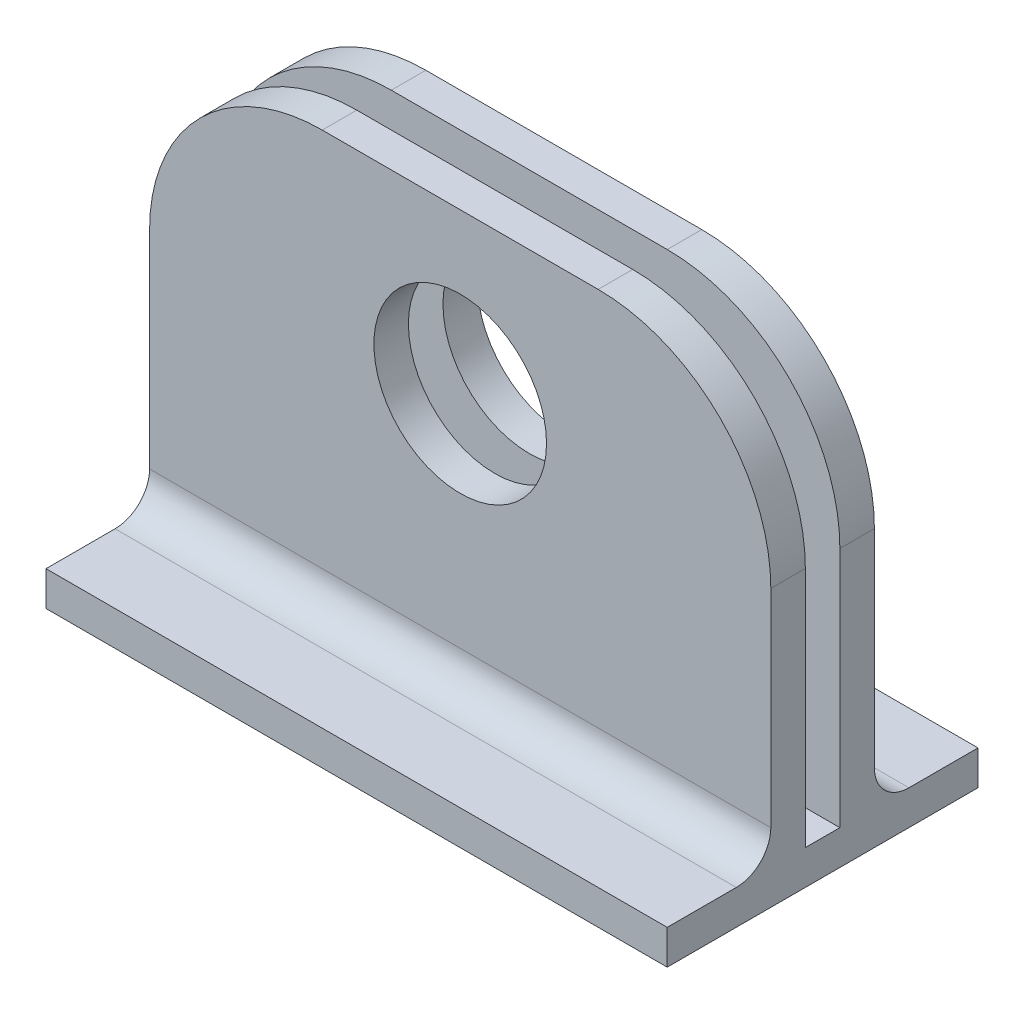
ISO-10303-21;
HEADER;
FILE_DESCRIPTION(('STEP AP214'),'2;1');
FILE_NAME('part.step','',(''),(''),'','','');
FILE_SCHEMA(('AUTOMOTIVE_DESIGN { 1 0 10303 214 1 1 1 1 }'));
ENDSEC;
DATA;
#1=APPLICATION_CONTEXT('core data for automotive mechanical design processes');
#2=APPLICATION_PROTOCOL_DEFINITION('international standard','automotive_design',2000,#1);
#3=PRODUCT_CONTEXT('',#1,'mechanical');
#4=PRODUCT('Part','Part','',(#3));
#5=PRODUCT_RELATED_PRODUCT_CATEGORY('part','',(#4));
#6=PRODUCT_DEFINITION_FORMATION('','',#4);
#7=PRODUCT_DEFINITION_CONTEXT('part definition',#1,'design');
#8=PRODUCT_DEFINITION('design','',#6,#7);
#9=PRODUCT_DEFINITION_SHAPE('','',#8);
#10=(LENGTH_UNIT() NAMED_UNIT(*) SI_UNIT(.MILLI.,.METRE.));
#11=(NAMED_UNIT(*) PLANE_ANGLE_UNIT() SI_UNIT($,.RADIAN.));
#12=(NAMED_UNIT(*) SI_UNIT($,.STERADIAN.) SOLID_ANGLE_UNIT());
#13=UNCERTAINTY_MEASURE_WITH_UNIT(LENGTH_MEASURE(1.E-05),#10,'distance_accuracy_value','');
#14=(GEOMETRIC_REPRESENTATION_CONTEXT(3) GLOBAL_UNCERTAINTY_ASSIGNED_CONTEXT((#13)) GLOBAL_UNIT_ASSIGNED_CONTEXT((#10,
#11,#12)) REPRESENTATION_CONTEXT('',''));
#15=CARTESIAN_POINT('',(0.,0.,0.));
#16=DIRECTION('',(0.,0.,1.));
#17=DIRECTION('',(1.,0.,0.));
#18=AXIS2_PLACEMENT_3D('',#15,#16,#17);
#19=CARTESIAN_POINT('',(35.9807500278961,2.,12.));
#20=DIRECTION('',(0.,1.,0.));
#21=DIRECTION('',(-1.,0.,0.));
#22=AXIS2_PLACEMENT_3D('',#19,#20,#21);
#23=PLANE('',#22);
#24=DIRECTION('',(0.,0.,-1.));
#25=VECTOR('',#24,1.);
#26=CARTESIAN_POINT('',(35.9807500278961,2.,12.));
#27=LINE('',#26,#25);
#28=CARTESIAN_POINT('',(35.9807500278961,2.,12.));
#29=VERTEX_POINT('',#28);
#30=CARTESIAN_POINT('',(35.9807500278961,2.,8.));
#31=VERTEX_POINT('',#30);
#32=EDGE_CURVE('E290',#29,#31,#27,.T.);
#33=ORIENTED_EDGE('',*,*,#32,.T.);
#34=DIRECTION('',(-1.,0.,0.));
#35=VECTOR('',#34,1.);
#36=CARTESIAN_POINT('',(35.9807500278961,2.,8.));
#37=LINE('',#36,#35);
#38=CARTESIAN_POINT('',(0.,2.,8.));
#39=VERTEX_POINT('',#38);
#40=EDGE_CURVE('E199',#31,#39,#37,.T.);
#41=ORIENTED_EDGE('',*,*,#40,.T.);
#42=DIRECTION('',(0.,0.,-1.));
#43=VECTOR('',#42,1.);
#44=CARTESIAN_POINT('',(0.,2.,12.));
#45=LINE('',#44,#43);
#46=CARTESIAN_POINT('',(0.,2.,12.));
#47=VERTEX_POINT('',#46);
#48=EDGE_CURVE('E180',#47,#39,#45,.T.);
#49=ORIENTED_EDGE('',*,*,#48,.F.);
#50=DIRECTION('',(1.,0.,0.));
#51=VECTOR('',#50,1.);
#52=CARTESIAN_POINT('',(35.9807500278961,2.,12.));
#53=LINE('',#52,#51);
#54=EDGE_CURVE('E287',#47,#29,#53,.T.);
#55=ORIENTED_EDGE('',*,*,#54,.T.);
#56=EDGE_LOOP('',(#33,#41,#49,#55));
#57=FACE_BOUND('',#56,.T.);
#58=ADVANCED_FACE('F35',(#57),#23,.T.);
#59=CARTESIAN_POINT('',(0.,0.,2.));
#60=DIRECTION('',(1.,0.,0.));
#61=DIRECTION('',(0.,0.,-1.));
#62=AXIS2_PLACEMENT_3D('',#59,#60,#61);
#63=PLANE('',#62);
#64=DIRECTION('',(0.,-1.,0.));
#65=VECTOR('',#64,1.);
#66=CARTESIAN_POINT('',(0.,0.,2.));
#67=LINE('',#66,#65);
#68=CARTESIAN_POINT('',(0.,16.,2.));
#69=VERTEX_POINT('',#68);
#70=CARTESIAN_POINT('',(0.,2.,2.));
#71=VERTEX_POINT('',#70);
#72=EDGE_CURVE('E297',#69,#71,#67,.T.);
#73=ORIENTED_EDGE('',*,*,#72,.F.);
#74=DIRECTION('',(0.,0.,-1.));
#75=VECTOR('',#74,1.);
#76=CARTESIAN_POINT('',(0.,16.,2.));
#77=LINE('',#76,#75);
#78=CARTESIAN_POINT('',(0.,16.,0.));
#79=VERTEX_POINT('',#78);
#80=EDGE_CURVE('E11',#69,#79,#77,.T.);
#81=ORIENTED_EDGE('',*,*,#80,.T.);
#82=DIRECTION('',(0.,-1.,0.));
#83=VECTOR('',#82,1.);
#84=CARTESIAN_POINT('',(0.,0.,0.));
#85=LINE('',#84,#83);
#86=CARTESIAN_POINT('',(0.,4.,0.));
#87=VERTEX_POINT('',#86);
#88=EDGE_CURVE('E296',#79,#87,#85,.T.);
#89=ORIENTED_EDGE('',*,*,#88,.T.);
#90=CARTESIAN_POINT('',(0.,4.,-2.));
#91=DIRECTION('',(1.,0.,0.));
#92=DIRECTION('',(0.,0.,-1.));
#93=AXIS2_PLACEMENT_3D('',#90,#91,#92);
#94=CIRCLE('',#93,2.);
#95=CARTESIAN_POINT('',(0.,2.,-2.));
#96=VERTEX_POINT('',#95);
#97=EDGE_CURVE('E206',#87,#96,#94,.T.);
#98=ORIENTED_EDGE('',*,*,#97,.T.);
#99=CARTESIAN_POINT('',(0.,2.,-6.));
#100=VERTEX_POINT('',#99);
#101=EDGE_CURVE('E181',#96,#100,#45,.T.);
#102=ORIENTED_EDGE('',*,*,#101,.T.);
#103=DIRECTION('',(0.,1.,0.));
#104=VECTOR('',#103,1.);
#105=CARTESIAN_POINT('',(0.,0.,-6.));
#106=LINE('',#105,#104);
#107=CARTESIAN_POINT('',(0.,0.,-6.));
#108=VERTEX_POINT('',#107);
#109=EDGE_CURVE('E272',#108,#100,#106,.T.);
#110=ORIENTED_EDGE('',*,*,#109,.F.);
#111=DIRECTION('',(0.,0.,-1.));
#112=VECTOR('',#111,1.);
#113=CARTESIAN_POINT('',(0.,0.,2.));
#114=LINE('',#113,#112);
#115=CARTESIAN_POINT('',(0.,0.,12.));
#116=VERTEX_POINT('',#115);
#117=EDGE_CURVE('E188',#116,#108,#114,.T.);
#118=ORIENTED_EDGE('',*,*,#117,.F.);
#119=DIRECTION('',(0.,1.,0.));
#120=VECTOR('',#119,1.);
#121=CARTESIAN_POINT('',(0.,0.,12.));
#122=LINE('',#121,#120);
#123=EDGE_CURVE('E284',#116,#47,#122,.T.);
#124=ORIENTED_EDGE('',*,*,#123,.T.);
#125=ORIENTED_EDGE('',*,*,#48,.T.);
#126=CARTESIAN_POINT('',(0.,4.,8.));
#127=DIRECTION('',(1.,0.,0.));
#128=DIRECTION('',(0.,0.,-1.));
#129=AXIS2_PLACEMENT_3D('',#126,#127,#128);
#130=CIRCLE('',#129,2.);
#131=CARTESIAN_POINT('',(0.,4.,6.));
#132=VERTEX_POINT('',#131);
#133=EDGE_CURVE('E208',#39,#132,#130,.T.);
#134=ORIENTED_EDGE('',*,*,#133,.T.);
#135=DIRECTION('',(0.,-1.,0.));
#136=VECTOR('',#135,1.);
#137=CARTESIAN_POINT('',(0.,0.,6.));
#138=LINE('',#137,#136);
#139=CARTESIAN_POINT('',(0.,16.,6.));
#140=VERTEX_POINT('',#139);
#141=EDGE_CURVE('E264',#140,#132,#138,.T.);
#142=ORIENTED_EDGE('',*,*,#141,.F.);
#143=DIRECTION('',(0.,0.,-1.));
#144=VECTOR('',#143,1.);
#145=CARTESIAN_POINT('',(0.,16.,2.));
#146=LINE('',#145,#144);
#147=CARTESIAN_POINT('',(0.,16.,4.));
#148=VERTEX_POINT('',#147);
#149=EDGE_CURVE('E44',#140,#148,#146,.T.);
#150=ORIENTED_EDGE('',*,*,#149,.T.);
#151=DIRECTION('',(0.,-1.,0.));
#152=VECTOR('',#151,1.);
#153=CARTESIAN_POINT('',(0.,0.,4.));
#154=LINE('',#153,#152);
#155=CARTESIAN_POINT('',(0.,2.,4.));
#156=VERTEX_POINT('',#155);
#157=EDGE_CURVE('E163',#148,#156,#154,.T.);
#158=ORIENTED_EDGE('',*,*,#157,.T.);
#159=EDGE_CURVE('E167',#156,#71,#45,.T.);
#160=ORIENTED_EDGE('',*,*,#159,.T.);
#161=EDGE_LOOP('',(#73,#81,#89,#98,#102,#110,#118,#124,#125,#134,#142,#150,#158,#160));
#162=FACE_BOUND('',#161,.T.);
#163=ADVANCED_FACE('F166',(#162),#63,.F.);
#164=CARTESIAN_POINT('',(0.,0.,2.));
#165=DIRECTION('',(0.,1.,0.));
#166=DIRECTION('',(0.,0.,1.));
#167=AXIS2_PLACEMENT_3D('',#164,#165,#166);
#168=PLANE('',#167);
#169=DIRECTION('',(-1.,0.,0.));
#170=VECTOR('',#169,1.);
#171=CARTESIAN_POINT('',(35.9807500278961,0.,-6.));
#172=LINE('',#171,#170);
#173=CARTESIAN_POINT('',(35.9807500278961,0.,-6.));
#174=VERTEX_POINT('',#173);
#175=EDGE_CURVE('E269',#174,#108,#172,.T.);
#176=ORIENTED_EDGE('',*,*,#175,.F.);
#177=DIRECTION('',(0.,0.,-1.));
#178=VECTOR('',#177,1.);
#179=CARTESIAN_POINT('',(35.9807500278961,0.,2.));
#180=LINE('',#179,#178);
#181=CARTESIAN_POINT('',(35.9807500278961,0.,12.));
#182=VERTEX_POINT('',#181);
#183=EDGE_CURVE('E193',#182,#174,#180,.T.);
#184=ORIENTED_EDGE('',*,*,#183,.F.);
#185=DIRECTION('',(-1.,0.,0.));
#186=VECTOR('',#185,1.);
#187=CARTESIAN_POINT('',(35.9807500278961,0.,12.));
#188=LINE('',#187,#186);
#189=EDGE_CURVE('E281',#182,#116,#188,.T.);
#190=ORIENTED_EDGE('',*,*,#189,.T.);
#191=ORIENTED_EDGE('',*,*,#117,.T.);
#192=EDGE_LOOP('',(#176,#184,#190,#191));
#193=FACE_BOUND('',#192,.T.);
#194=ADVANCED_FACE('F316',(#193),#168,.F.);
#195=CARTESIAN_POINT('',(35.9807500278961,0.,2.));
#196=DIRECTION('',(-1.,0.,0.));
#197=DIRECTION('',(0.,0.,1.));
#198=AXIS2_PLACEMENT_3D('',#195,#196,#197);
#199=PLANE('',#198);
#200=DIRECTION('',(0.,1.,0.));
#201=VECTOR('',#200,1.);
#202=CARTESIAN_POINT('',(35.9807500278961,0.,0.));
#203=LINE('',#202,#201);
#204=CARTESIAN_POINT('',(35.9807500278961,4.,0.));
#205=VERTEX_POINT('',#204);
#206=CARTESIAN_POINT('',(35.9807500278961,16.,0.));
#207=VERTEX_POINT('',#206);
#208=EDGE_CURVE('E307',#205,#207,#203,.T.);
#209=ORIENTED_EDGE('',*,*,#208,.T.);
#210=DIRECTION('',(0.,0.,-1.));
#211=VECTOR('',#210,1.);
#212=CARTESIAN_POINT('',(35.9807500278961,16.,2.));
#213=LINE('',#212,#211);
#214=CARTESIAN_POINT('',(35.9807500278961,16.,2.));
#215=VERTEX_POINT('',#214);
#216=EDGE_CURVE('E224',#207,#215,#213,.F.);
#217=ORIENTED_EDGE('',*,*,#216,.T.);
#218=DIRECTION('',(0.,1.,0.));
#219=VECTOR('',#218,1.);
#220=CARTESIAN_POINT('',(35.9807500278961,0.,2.));
#221=LINE('',#220,#219);
#222=CARTESIAN_POINT('',(35.9807500278961,2.,2.));
#223=VERTEX_POINT('',#222);
#224=EDGE_CURVE('E299',#223,#215,#221,.T.);
#225=ORIENTED_EDGE('',*,*,#224,.F.);
#226=CARTESIAN_POINT('',(35.9807500278961,2.,4.));
#227=VERTEX_POINT('',#226);
#228=EDGE_CURVE('E262',#227,#223,#27,.T.);
#229=ORIENTED_EDGE('',*,*,#228,.F.);
#230=DIRECTION('',(0.,1.,0.));
#231=VECTOR('',#230,1.);
#232=CARTESIAN_POINT('',(35.9807500278961,0.,4.));
#233=LINE('',#232,#231);
#234=CARTESIAN_POINT('',(35.9807500278961,16.,4.));
#235=VERTEX_POINT('',#234);
#236=EDGE_CURVE('E171',#227,#235,#233,.T.);
#237=ORIENTED_EDGE('',*,*,#236,.T.);
#238=DIRECTION('',(0.,0.,-1.));
#239=VECTOR('',#238,1.);
#240=CARTESIAN_POINT('',(35.9807500278961,16.,2.));
#241=LINE('',#240,#239);
#242=CARTESIAN_POINT('',(35.9807500278961,16.,6.));
#243=VERTEX_POINT('',#242);
#244=EDGE_CURVE('E222',#235,#243,#241,.F.);
#245=ORIENTED_EDGE('',*,*,#244,.T.);
#246=DIRECTION('',(0.,1.,0.));
#247=VECTOR('',#246,1.);
#248=CARTESIAN_POINT('',(35.9807500278961,0.,6.));
#249=LINE('',#248,#247);
#250=CARTESIAN_POINT('',(35.9807500278961,4.,6.));
#251=VERTEX_POINT('',#250);
#252=EDGE_CURVE('E247',#251,#243,#249,.T.);
#253=ORIENTED_EDGE('',*,*,#252,.F.);
#254=CARTESIAN_POINT('',(35.9807500278961,4.,8.));
#255=DIRECTION('',(-1.,0.,0.));
#256=DIRECTION('',(0.,0.,1.));
#257=AXIS2_PLACEMENT_3D('',#254,#255,#256);
#258=CIRCLE('',#257,2.);
#259=EDGE_CURVE('E211',#251,#31,#258,.T.);
#260=ORIENTED_EDGE('',*,*,#259,.T.);
#261=ORIENTED_EDGE('',*,*,#32,.F.);
#262=DIRECTION('',(0.,-1.,0.));
#263=VECTOR('',#262,1.);
#264=CARTESIAN_POINT('',(35.9807500278961,0.,12.));
#265=LINE('',#264,#263);
#266=EDGE_CURVE('E278',#29,#182,#265,.T.);
#267=ORIENTED_EDGE('',*,*,#266,.T.);
#268=ORIENTED_EDGE('',*,*,#183,.T.);
#269=DIRECTION('',(0.,-1.,0.));
#270=VECTOR('',#269,1.);
#271=CARTESIAN_POINT('',(35.9807500278961,0.,-6.));
#272=LINE('',#271,#270);
#273=CARTESIAN_POINT('',(35.9807500278961,2.,-6.));
#274=VERTEX_POINT('',#273);
#275=EDGE_CURVE('E254',#274,#174,#272,.T.);
#276=ORIENTED_EDGE('',*,*,#275,.F.);
#277=CARTESIAN_POINT('',(35.9807500278961,2.,-2.));
#278=VERTEX_POINT('',#277);
#279=EDGE_CURVE('E292',#278,#274,#27,.T.);
#280=ORIENTED_EDGE('',*,*,#279,.F.);
#281=CARTESIAN_POINT('',(35.9807500278961,4.,-2.));
#282=DIRECTION('',(-1.,0.,0.));
#283=DIRECTION('',(0.,0.,1.));
#284=AXIS2_PLACEMENT_3D('',#281,#282,#283);
#285=CIRCLE('',#284,2.);
#286=EDGE_CURVE('E204',#278,#205,#285,.T.);
#287=ORIENTED_EDGE('',*,*,#286,.T.);
#288=EDGE_LOOP('',(#209,#217,#225,#229,#237,#245,#253,#260,#261,#267,#268,#276,#280,#287));
#289=FACE_BOUND('',#288,.T.);
#290=ADVANCED_FACE('F260',(#289),#199,.F.);
#291=CARTESIAN_POINT('',(0.,26.,2.));
#292=DIRECTION('',(0.,-1.,0.));
#293=DIRECTION('',(0.,0.,-1.));
#294=AXIS2_PLACEMENT_3D('',#291,#292,#293);
#295=PLANE('',#294);
#296=DIRECTION('',(-1.,0.,0.));
#297=VECTOR('',#296,1.);
#298=CARTESIAN_POINT('',(0.,26.,2.));
#299=LINE('',#298,#297);
#300=CARTESIAN_POINT('',(25.9807500278961,26.,2.));
#301=VERTEX_POINT('',#300);
#302=CARTESIAN_POINT('',(10.,26.,2.));
#303=VERTEX_POINT('',#302);
#304=EDGE_CURVE('E303',#301,#303,#299,.T.);
#305=ORIENTED_EDGE('',*,*,#304,.F.);
#306=DIRECTION('',(0.,0.,-1.));
#307=VECTOR('',#306,1.);
#308=CARTESIAN_POINT('',(25.9807500278961,26.,2.));
#309=LINE('',#308,#307);
#310=CARTESIAN_POINT('',(25.9807500278961,26.,0.));
#311=VERTEX_POINT('',#310);
#312=EDGE_CURVE('E215',#301,#311,#309,.T.);
#313=ORIENTED_EDGE('',*,*,#312,.T.);
#314=DIRECTION('',(-1.,0.,0.));
#315=VECTOR('',#314,1.);
#316=CARTESIAN_POINT('',(0.,26.,0.));
#317=LINE('',#316,#315);
#318=CARTESIAN_POINT('',(10.,26.,0.));
#319=VERTEX_POINT('',#318);
#320=EDGE_CURVE('E300',#311,#319,#317,.T.);
#321=ORIENTED_EDGE('',*,*,#320,.T.);
#322=DIRECTION('',(0.,0.,-1.));
#323=VECTOR('',#322,1.);
#324=CARTESIAN_POINT('',(10.,26.,2.));
#325=LINE('',#324,#323);
#326=EDGE_CURVE('E213',#319,#303,#325,.F.);
#327=ORIENTED_EDGE('',*,*,#326,.T.);
#328=EDGE_LOOP('',(#305,#313,#321,#327));
#329=FACE_BOUND('',#328,.T.);
#330=ADVANCED_FACE('F336',(#329),#295,.F.);
#331=CARTESIAN_POINT('',(0.,0.,2.));
#332=DIRECTION('',(0.,0.,-1.));
#333=DIRECTION('',(-1.,0.,0.));
#334=AXIS2_PLACEMENT_3D('',#331,#332,#333);
#335=PLANE('',#334);
#336=CARTESIAN_POINT('',(17.990375013948,16.77,2.));
#337=DIRECTION('',(0.,0.,-1.));
#338=DIRECTION('',(-1.,0.,0.));
#339=AXIS2_PLACEMENT_3D('',#336,#337,#338);
#340=CIRCLE('',#339,5.);
#341=CARTESIAN_POINT('',(12.990375013948,16.77,2.));
#342=VERTEX_POINT('',#341);
#343=EDGE_CURVE('E172',#342,#342,#340,.T.);
#344=ORIENTED_EDGE('',*,*,#343,.T.);
#345=EDGE_LOOP('',(#344));
#346=FACE_BOUND('',#345,.T.);
#347=ORIENTED_EDGE('',*,*,#224,.T.);
#348=CARTESIAN_POINT('',(25.9807500278961,16.,2.));
#349=DIRECTION('',(0.,0.,-1.));
#350=DIRECTION('',(-1.,0.,0.));
#351=AXIS2_PLACEMENT_3D('',#348,#349,#350);
#352=CIRCLE('',#351,10.);
#353=EDGE_CURVE('E228',#215,#301,#352,.F.);
#354=ORIENTED_EDGE('',*,*,#353,.T.);
#355=ORIENTED_EDGE('',*,*,#304,.T.);
#356=CARTESIAN_POINT('',(10.,16.,2.));
#357=DIRECTION('',(0.,0.,-1.));
#358=DIRECTION('',(-1.,0.,0.));
#359=AXIS2_PLACEMENT_3D('',#356,#357,#358);
#360=CIRCLE('',#359,10.);
#361=EDGE_CURVE('E226',#303,#69,#360,.F.);
#362=ORIENTED_EDGE('',*,*,#361,.T.);
#363=ORIENTED_EDGE('',*,*,#72,.T.);
#364=DIRECTION('',(1.,0.,0.));
#365=VECTOR('',#364,1.);
#366=CARTESIAN_POINT('',(0.,2.,2.));
#367=LINE('',#366,#365);
#368=EDGE_CURVE('E179',#71,#223,#367,.T.);
#369=ORIENTED_EDGE('',*,*,#368,.T.);
#370=EDGE_LOOP('',(#347,#354,#355,#362,#363,#369));
#371=FACE_BOUND('',#370,.T.);
#372=ADVANCED_FACE('F326',(#346,#371),#335,.F.);
#373=CARTESIAN_POINT('',(0.,0.,0.));
#374=DIRECTION('',(0.,0.,-1.));
#375=DIRECTION('',(-1.,0.,0.));
#376=AXIS2_PLACEMENT_3D('',#373,#374,#375);
#377=PLANE('',#376);
#378=CARTESIAN_POINT('',(17.990375013948,16.77,0.));
#379=DIRECTION('',(0.,0.,1.));
#380=DIRECTION('',(1.,0.,0.));
#381=AXIS2_PLACEMENT_3D('',#378,#379,#380);
#382=CIRCLE('',#381,5.);
#383=CARTESIAN_POINT('',(22.990375013948,16.77,0.));
#384=VERTEX_POINT('',#383);
#385=EDGE_CURVE('E367',#384,#384,#382,.T.);
#386=ORIENTED_EDGE('',*,*,#385,.T.);
#387=EDGE_LOOP('',(#386));
#388=FACE_BOUND('',#387,.T.);
#389=ORIENTED_EDGE('',*,*,#320,.F.);
#390=CARTESIAN_POINT('',(25.9807500278961,16.,0.));
#391=DIRECTION('',(0.,0.,-1.));
#392=DIRECTION('',(-1.,0.,0.));
#393=AXIS2_PLACEMENT_3D('',#390,#391,#392);
#394=CIRCLE('',#393,10.);
#395=EDGE_CURVE('E220',#311,#207,#394,.T.);
#396=ORIENTED_EDGE('',*,*,#395,.T.);
#397=ORIENTED_EDGE('',*,*,#208,.F.);
#398=DIRECTION('',(1.,0.,0.));
#399=VECTOR('',#398,1.);
#400=CARTESIAN_POINT('',(0.,4.,0.));
#401=LINE('',#400,#399);
#402=EDGE_CURVE('E191',#205,#87,#401,.F.);
#403=ORIENTED_EDGE('',*,*,#402,.T.);
#404=ORIENTED_EDGE('',*,*,#88,.F.);
#405=CARTESIAN_POINT('',(10.,16.,0.));
#406=DIRECTION('',(0.,0.,-1.));
#407=DIRECTION('',(-1.,0.,0.));
#408=AXIS2_PLACEMENT_3D('',#405,#406,#407);
#409=CIRCLE('',#408,10.);
#410=EDGE_CURVE('E218',#79,#319,#409,.T.);
#411=ORIENTED_EDGE('',*,*,#410,.T.);
#412=EDGE_LOOP('',(#389,#396,#397,#403,#404,#411));
#413=FACE_BOUND('',#412,.T.);
#414=ADVANCED_FACE('F344',(#388,#413),#377,.T.);
#415=CARTESIAN_POINT('',(0.,0.,-6.));
#416=DIRECTION('',(0.,0.,1.));
#417=DIRECTION('',(1.,0.,0.));
#418=AXIS2_PLACEMENT_3D('',#415,#416,#417);
#419=PLANE('',#418);
#420=ORIENTED_EDGE('',*,*,#275,.T.);
#421=ORIENTED_EDGE('',*,*,#175,.T.);
#422=ORIENTED_EDGE('',*,*,#109,.T.);
#423=DIRECTION('',(1.,0.,0.));
#424=VECTOR('',#423,1.);
#425=CARTESIAN_POINT('',(35.9807500278961,2.,-6.));
#426=LINE('',#425,#424);
#427=EDGE_CURVE('E275',#100,#274,#426,.T.);
#428=ORIENTED_EDGE('',*,*,#427,.T.);
#429=EDGE_LOOP('',(#420,#421,#422,#428));
#430=FACE_BOUND('',#429,.T.);
#431=ADVANCED_FACE('F319',(#430),#419,.F.);
#432=ORIENTED_EDGE('',*,*,#101,.F.);
#433=DIRECTION('',(1.,0.,0.));
#434=VECTOR('',#433,1.);
#435=CARTESIAN_POINT('',(35.9807500278961,2.,-2.));
#436=LINE('',#435,#434);
#437=EDGE_CURVE('E187',#96,#278,#436,.T.);
#438=ORIENTED_EDGE('',*,*,#437,.T.);
#439=ORIENTED_EDGE('',*,*,#279,.T.);
#440=ORIENTED_EDGE('',*,*,#427,.F.);
#441=EDGE_LOOP('',(#432,#438,#439,#440));
#442=FACE_BOUND('',#441,.T.);
#443=ADVANCED_FACE('F323',(#442),#23,.T.);
#444=DIRECTION('',(-1.,0.,0.));
#445=VECTOR('',#444,1.);
#446=CARTESIAN_POINT('',(35.9807500278961,2.,4.));
#447=LINE('',#446,#445);
#448=EDGE_CURVE('E176',#227,#156,#447,.T.);
#449=ORIENTED_EDGE('',*,*,#448,.F.);
#450=ORIENTED_EDGE('',*,*,#228,.T.);
#451=ORIENTED_EDGE('',*,*,#368,.F.);
#452=ORIENTED_EDGE('',*,*,#159,.F.);
#453=EDGE_LOOP('',(#449,#450,#451,#452));
#454=FACE_BOUND('',#453,.T.);
#455=ADVANCED_FACE('F175',(#454),#23,.T.);
#456=CARTESIAN_POINT('',(0.,0.,12.));
#457=DIRECTION('',(0.,0.,1.));
#458=DIRECTION('',(1.,0.,0.));
#459=AXIS2_PLACEMENT_3D('',#456,#457,#458);
#460=PLANE('',#459);
#461=ORIENTED_EDGE('',*,*,#266,.F.);
#462=ORIENTED_EDGE('',*,*,#54,.F.);
#463=ORIENTED_EDGE('',*,*,#123,.F.);
#464=ORIENTED_EDGE('',*,*,#189,.F.);
#465=EDGE_LOOP('',(#461,#462,#463,#464));
#466=FACE_BOUND('',#465,.T.);
#467=ADVANCED_FACE('F352',(#466),#460,.T.);
#468=CARTESIAN_POINT('',(0.,26.,6.));
#469=DIRECTION('',(0.,-1.,0.));
#470=DIRECTION('',(0.,0.,-1.));
#471=AXIS2_PLACEMENT_3D('',#468,#469,#470);
#472=PLANE('',#471);
#473=DIRECTION('',(-1.,0.,0.));
#474=VECTOR('',#473,1.);
#475=CARTESIAN_POINT('',(0.,26.,6.));
#476=LINE('',#475,#474);
#477=CARTESIAN_POINT('',(25.9807500278961,26.,6.));
#478=VERTEX_POINT('',#477);
#479=CARTESIAN_POINT('',(10.,26.,6.));
#480=VERTEX_POINT('',#479);
#481=EDGE_CURVE('E245',#478,#480,#476,.T.);
#482=ORIENTED_EDGE('',*,*,#481,.F.);
#483=DIRECTION('',(0.,0.,-1.));
#484=VECTOR('',#483,1.);
#485=CARTESIAN_POINT('',(25.9807500278961,26.,6.));
#486=LINE('',#485,#484);
#487=CARTESIAN_POINT('',(25.9807500278961,26.,4.));
#488=VERTEX_POINT('',#487);
#489=EDGE_CURVE('E232',#478,#488,#486,.T.);
#490=ORIENTED_EDGE('',*,*,#489,.T.);
#491=DIRECTION('',(-1.,0.,0.));
#492=VECTOR('',#491,1.);
#493=CARTESIAN_POINT('',(0.,26.,4.));
#494=LINE('',#493,#492);
#495=CARTESIAN_POINT('',(10.,26.,4.));
#496=VERTEX_POINT('',#495);
#497=EDGE_CURVE('E257',#488,#496,#494,.T.);
#498=ORIENTED_EDGE('',*,*,#497,.T.);
#499=DIRECTION('',(0.,0.,-1.));
#500=VECTOR('',#499,1.);
#501=CARTESIAN_POINT('',(10.,26.,6.));
#502=LINE('',#501,#500);
#503=EDGE_CURVE('E230',#496,#480,#502,.F.);
#504=ORIENTED_EDGE('',*,*,#503,.T.);
#505=EDGE_LOOP('',(#482,#490,#498,#504));
#506=FACE_BOUND('',#505,.T.);
#507=ADVANCED_FACE('F252',(#506),#472,.F.);
#508=CARTESIAN_POINT('',(0.,0.,6.));
#509=DIRECTION('',(0.,0.,-1.));
#510=DIRECTION('',(-1.,0.,0.));
#511=AXIS2_PLACEMENT_3D('',#508,#509,#510);
#512=PLANE('',#511);
#513=CARTESIAN_POINT('',(17.990375013948,16.77,6.));
#514=DIRECTION('',(0.,0.,1.));
#515=DIRECTION('',(1.,0.,0.));
#516=AXIS2_PLACEMENT_3D('',#513,#514,#515);
#517=CIRCLE('',#516,5.);
#518=CARTESIAN_POINT('',(22.990375013948,16.77,6.));
#519=VERTEX_POINT('',#518);
#520=EDGE_CURVE('E364',#519,#519,#517,.T.);
#521=ORIENTED_EDGE('',*,*,#520,.F.);
#522=EDGE_LOOP('',(#521));
#523=FACE_BOUND('',#522,.T.);
#524=ORIENTED_EDGE('',*,*,#252,.T.);
#525=CARTESIAN_POINT('',(25.9807500278961,16.,6.));
#526=DIRECTION('',(0.,0.,-1.));
#527=DIRECTION('',(-1.,0.,0.));
#528=AXIS2_PLACEMENT_3D('',#525,#526,#527);
#529=CIRCLE('',#528,10.);
#530=EDGE_CURVE('E239',#243,#478,#529,.F.);
#531=ORIENTED_EDGE('',*,*,#530,.T.);
#532=ORIENTED_EDGE('',*,*,#481,.T.);
#533=CARTESIAN_POINT('',(10.,16.,6.));
#534=DIRECTION('',(0.,0.,-1.));
#535=DIRECTION('',(-1.,0.,0.));
#536=AXIS2_PLACEMENT_3D('',#533,#534,#535);
#537=CIRCLE('',#536,10.);
#538=EDGE_CURVE('E51',#480,#140,#537,.F.);
#539=ORIENTED_EDGE('',*,*,#538,.T.);
#540=ORIENTED_EDGE('',*,*,#141,.T.);
#541=DIRECTION('',(-1.,0.,0.));
#542=VECTOR('',#541,1.);
#543=CARTESIAN_POINT('',(0.,4.,6.));
#544=LINE('',#543,#542);
#545=EDGE_CURVE('E202',#132,#251,#544,.F.);
#546=ORIENTED_EDGE('',*,*,#545,.T.);
#547=EDGE_LOOP('',(#524,#531,#532,#539,#540,#546));
#548=FACE_BOUND('',#547,.T.);
#549=ADVANCED_FACE('F244',(#523,#548),#512,.F.);
#550=CARTESIAN_POINT('',(0.,0.,4.));
#551=DIRECTION('',(0.,0.,-1.));
#552=DIRECTION('',(-1.,0.,0.));
#553=AXIS2_PLACEMENT_3D('',#550,#551,#552);
#554=PLANE('',#553);
#555=CARTESIAN_POINT('',(17.990375013948,16.77,4.));
#556=DIRECTION('',(0.,0.,-1.));
#557=DIRECTION('',(-1.,0.,0.));
#558=AXIS2_PLACEMENT_3D('',#555,#556,#557);
#559=CIRCLE('',#558,5.);
#560=CARTESIAN_POINT('',(12.990375013948,16.77,4.));
#561=VERTEX_POINT('',#560);
#562=EDGE_CURVE('E39',#561,#561,#559,.T.);
#563=ORIENTED_EDGE('',*,*,#562,.F.);
#564=EDGE_LOOP('',(#563));
#565=FACE_BOUND('',#564,.T.);
#566=ORIENTED_EDGE('',*,*,#497,.F.);
#567=CARTESIAN_POINT('',(25.9807500278961,16.,4.));
#568=DIRECTION('',(0.,0.,-1.));
#569=DIRECTION('',(-1.,0.,0.));
#570=AXIS2_PLACEMENT_3D('',#567,#568,#569);
#571=CIRCLE('',#570,10.);
#572=EDGE_CURVE('E236',#488,#235,#571,.T.);
#573=ORIENTED_EDGE('',*,*,#572,.T.);
#574=ORIENTED_EDGE('',*,*,#236,.F.);
#575=ORIENTED_EDGE('',*,*,#448,.T.);
#576=ORIENTED_EDGE('',*,*,#157,.F.);
#577=CARTESIAN_POINT('',(10.,16.,4.));
#578=DIRECTION('',(0.,0.,-1.));
#579=DIRECTION('',(-1.,0.,0.));
#580=AXIS2_PLACEMENT_3D('',#577,#578,#579);
#581=CIRCLE('',#580,10.);
#582=EDGE_CURVE('E59',#148,#496,#581,.T.);
#583=ORIENTED_EDGE('',*,*,#582,.T.);
#584=EDGE_LOOP('',(#566,#573,#574,#575,#576,#583));
#585=FACE_BOUND('',#584,.T.);
#586=ADVANCED_FACE('F185',(#565,#585),#554,.T.);
#587=CARTESIAN_POINT('',(35.9807500278961,4.,-2.));
#588=DIRECTION('',(-1.,0.,0.));
#589=DIRECTION('',(0.,-1.,0.));
#590=AXIS2_PLACEMENT_3D('',#587,#588,#589);
#591=CYLINDRICAL_SURFACE('',#590,2.);
#592=ORIENTED_EDGE('',*,*,#97,.F.);
#593=ORIENTED_EDGE('',*,*,#402,.F.);
#594=ORIENTED_EDGE('',*,*,#286,.F.);
#595=ORIENTED_EDGE('',*,*,#437,.F.);
#596=EDGE_LOOP('',(#592,#593,#594,#595));
#597=FACE_BOUND('',#596,.T.);
#598=ADVANCED_FACE('F348',(#597),#591,.F.);
#599=CARTESIAN_POINT('',(35.9807500278961,4.,8.));
#600=DIRECTION('',(-1.,0.,0.));
#601=DIRECTION('',(0.,-1.,0.));
#602=AXIS2_PLACEMENT_3D('',#599,#600,#601);
#603=CYLINDRICAL_SURFACE('',#602,2.);
#604=ORIENTED_EDGE('',*,*,#259,.F.);
#605=ORIENTED_EDGE('',*,*,#545,.F.);
#606=ORIENTED_EDGE('',*,*,#133,.F.);
#607=ORIENTED_EDGE('',*,*,#40,.F.);
#608=EDGE_LOOP('',(#604,#605,#606,#607));
#609=FACE_BOUND('',#608,.T.);
#610=ADVANCED_FACE('F358',(#609),#603,.F.);
#611=CARTESIAN_POINT('',(25.9807500278961,16.,2.));
#612=DIRECTION('',(0.,0.,-1.));
#613=DIRECTION('',(-1.,0.,0.));
#614=AXIS2_PLACEMENT_3D('',#611,#612,#613);
#615=CYLINDRICAL_SURFACE('',#614,10.);
#616=ORIENTED_EDGE('',*,*,#353,.F.);
#617=ORIENTED_EDGE('',*,*,#216,.F.);
#618=ORIENTED_EDGE('',*,*,#395,.F.);
#619=ORIENTED_EDGE('',*,*,#312,.F.);
#620=EDGE_LOOP('',(#616,#617,#618,#619));
#621=FACE_BOUND('',#620,.T.);
#622=ADVANCED_FACE('F331',(#621),#615,.T.);
#623=CARTESIAN_POINT('',(25.9807500278961,16.,6.));
#624=DIRECTION('',(0.,0.,-1.));
#625=DIRECTION('',(-1.,0.,0.));
#626=AXIS2_PLACEMENT_3D('',#623,#624,#625);
#627=CYLINDRICAL_SURFACE('',#626,10.);
#628=ORIENTED_EDGE('',*,*,#530,.F.);
#629=ORIENTED_EDGE('',*,*,#244,.F.);
#630=ORIENTED_EDGE('',*,*,#572,.F.);
#631=ORIENTED_EDGE('',*,*,#489,.F.);
#632=EDGE_LOOP('',(#628,#629,#630,#631));
#633=FACE_BOUND('',#632,.T.);
#634=ADVANCED_FACE('F256',(#633),#627,.T.);
#635=CARTESIAN_POINT('',(10.,16.,2.));
#636=DIRECTION('',(0.,0.,-1.));
#637=DIRECTION('',(-1.,0.,0.));
#638=AXIS2_PLACEMENT_3D('',#635,#636,#637);
#639=CYLINDRICAL_SURFACE('',#638,10.);
#640=ORIENTED_EDGE('',*,*,#361,.F.);
#641=ORIENTED_EDGE('',*,*,#326,.F.);
#642=ORIENTED_EDGE('',*,*,#410,.F.);
#643=ORIENTED_EDGE('',*,*,#80,.F.);
#644=EDGE_LOOP('',(#640,#641,#642,#643));
#645=FACE_BOUND('',#644,.T.);
#646=ADVANCED_FACE('F340',(#645),#639,.T.);
#647=CARTESIAN_POINT('',(10.,16.,2.));
#648=DIRECTION('',(0.,0.,-1.));
#649=DIRECTION('',(-1.,0.,0.));
#650=AXIS2_PLACEMENT_3D('',#647,#648,#649);
#651=CYLINDRICAL_SURFACE('',#650,10.);
#652=ORIENTED_EDGE('',*,*,#538,.F.);
#653=ORIENTED_EDGE('',*,*,#503,.F.);
#654=ORIENTED_EDGE('',*,*,#582,.F.);
#655=ORIENTED_EDGE('',*,*,#149,.F.);
#656=EDGE_LOOP('',(#652,#653,#654,#655));
#657=FACE_BOUND('',#656,.T.);
#658=ADVANCED_FACE('F37',(#657),#651,.T.);
#659=CARTESIAN_POINT('',(17.990375013948,16.77,0.));
#660=DIRECTION('',(0.,0.,1.));
#661=DIRECTION('',(1.,0.,0.));
#662=AXIS2_PLACEMENT_3D('',#659,#660,#661);
#663=CYLINDRICAL_SURFACE('',#662,5.);
#664=ORIENTED_EDGE('',*,*,#562,.T.);
#665=EDGE_LOOP('',(#664));
#666=FACE_BOUND('',#665,.T.);
#667=ORIENTED_EDGE('',*,*,#520,.T.);
#668=EDGE_LOOP('',(#667));
#669=FACE_BOUND('',#668,.T.);
#670=ADVANCED_FACE('F374',(#666,#669),#663,.F.);
#671=ORIENTED_EDGE('',*,*,#385,.F.);
#672=EDGE_LOOP('',(#671));
#673=FACE_BOUND('',#672,.T.);
#674=ORIENTED_EDGE('',*,*,#343,.F.);
#675=EDGE_LOOP('',(#674));
#676=FACE_BOUND('',#675,.T.);
#677=ADVANCED_FACE('F435',(#673,#676),#663,.F.);
#678=CLOSED_SHELL('',(#58,#163,#194,#290,#330,#372,#414,#431,#443,#455,#467,#507,#549,#586,#598,
#610,#622,#634,#646,#658,#670,#677));
#679=MANIFOLD_SOLID_BREP('B2',#678);
#680=ADVANCED_BREP_SHAPE_REPRESENTATION('',(#18,#679),#14);
#681=SHAPE_DEFINITION_REPRESENTATION(#9,#680);
ENDSEC;
END-ISO-10303-21;
